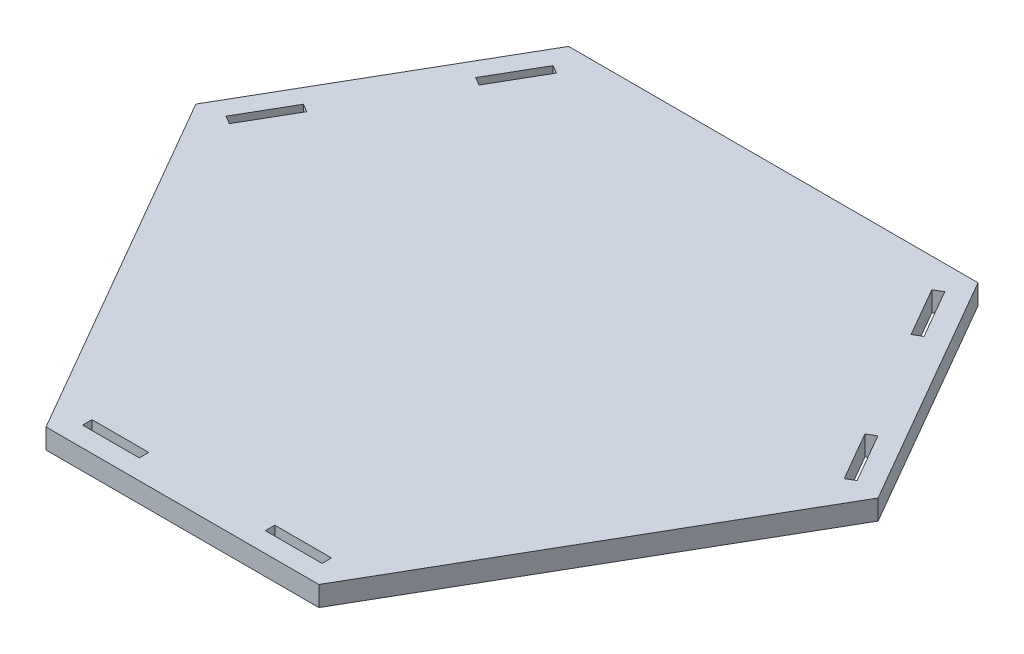
ISO-10303-21;
HEADER;
FILE_DESCRIPTION(('STEP AP214'),'2;1');
FILE_NAME('part.step','',(''),(''),'','','');
FILE_SCHEMA(('AUTOMOTIVE_DESIGN { 1 0 10303 214 1 1 1 1 }'));
ENDSEC;
DATA;
#1=APPLICATION_CONTEXT('core data for automotive mechanical design processes');
#2=APPLICATION_PROTOCOL_DEFINITION('international standard','automotive_design',2000,#1);
#3=PRODUCT_CONTEXT('',#1,'mechanical');
#4=PRODUCT('Part','Part','',(#3));
#5=PRODUCT_RELATED_PRODUCT_CATEGORY('part','',(#4));
#6=PRODUCT_DEFINITION_FORMATION('','',#4);
#7=PRODUCT_DEFINITION_CONTEXT('part definition',#1,'design');
#8=PRODUCT_DEFINITION('design','',#6,#7);
#9=PRODUCT_DEFINITION_SHAPE('','',#8);
#10=(LENGTH_UNIT() NAMED_UNIT(*) SI_UNIT(.MILLI.,.METRE.));
#11=(NAMED_UNIT(*) PLANE_ANGLE_UNIT() SI_UNIT($,.RADIAN.));
#12=(NAMED_UNIT(*) SI_UNIT($,.STERADIAN.) SOLID_ANGLE_UNIT());
#13=UNCERTAINTY_MEASURE_WITH_UNIT(LENGTH_MEASURE(1.E-05),#10,'distance_accuracy_value','');
#14=(GEOMETRIC_REPRESENTATION_CONTEXT(3) GLOBAL_UNCERTAINTY_ASSIGNED_CONTEXT((#13)) GLOBAL_UNIT_ASSIGNED_CONTEXT((#10,
#11,#12)) REPRESENTATION_CONTEXT('',''));
#15=CARTESIAN_POINT('',(0.,0.,0.));
#16=DIRECTION('',(0.,0.,1.));
#17=DIRECTION('',(1.,0.,0.));
#18=AXIS2_PLACEMENT_3D('',#15,#16,#17);
#19=CARTESIAN_POINT('',(-86.6025403784439,6.35,-50.));
#20=DIRECTION('',(0.866025403784439,0.,0.5));
#21=DIRECTION('',(0.5,0.,-0.866025403784439));
#22=AXIS2_PLACEMENT_3D('',#19,#20,#21);
#23=PLANE('',#22);
#24=DIRECTION('',(-0.5,0.,0.866025403784439));
#25=VECTOR('',#24,1.);
#26=CARTESIAN_POINT('',(-86.6025403784439,0.,-50.));
#27=LINE('',#26,#25);
#28=CARTESIAN_POINT('',(-64.9519052838329,0.,-87.5));
#29=VERTEX_POINT('',#28);
#30=CARTESIAN_POINT('',(-108.253175473055,0.,-12.5));
#31=VERTEX_POINT('',#30);
#32=EDGE_CURVE('E428',#29,#31,#27,.T.);
#33=ORIENTED_EDGE('',*,*,#32,.T.);
#34=DIRECTION('',(0.,-1.,0.));
#35=VECTOR('',#34,1.);
#36=CARTESIAN_POINT('',(-108.253175473055,6.35,-12.5));
#37=LINE('',#36,#35);
#38=CARTESIAN_POINT('',(-108.253175473055,6.35,-12.5));
#39=VERTEX_POINT('',#38);
#40=EDGE_CURVE('E11',#39,#31,#37,.T.);
#41=ORIENTED_EDGE('',*,*,#40,.F.);
#42=DIRECTION('',(-0.5,0.,0.866025403784439));
#43=VECTOR('',#42,1.);
#44=CARTESIAN_POINT('',(-86.6025403784439,6.35,-50.));
#45=LINE('',#44,#43);
#46=CARTESIAN_POINT('',(-64.9519052838329,6.35,-87.5));
#47=VERTEX_POINT('',#46);
#48=EDGE_CURVE('E435',#47,#39,#45,.T.);
#49=ORIENTED_EDGE('',*,*,#48,.F.);
#50=DIRECTION('',(0.,-1.,0.));
#51=VECTOR('',#50,1.);
#52=CARTESIAN_POINT('',(-64.9519052838329,6.35,-87.5));
#53=LINE('',#52,#51);
#54=EDGE_CURVE('E449',#47,#29,#53,.T.);
#55=ORIENTED_EDGE('',*,*,#54,.T.);
#56=EDGE_LOOP('',(#33,#41,#49,#55));
#57=FACE_BOUND('',#56,.T.);
#58=ADVANCED_FACE('F39',(#57),#23,.F.);
#59=CARTESIAN_POINT('',(-75.7772228311384,6.35,43.75));
#60=DIRECTION('',(0.866025403784439,0.,-0.5));
#61=DIRECTION('',(-0.5,0.,-0.866025403784439));
#62=AXIS2_PLACEMENT_3D('',#59,#60,#61);
#63=PLANE('',#62);
#64=DIRECTION('',(0.5,0.,0.866025403784439));
#65=VECTOR('',#64,1.);
#66=CARTESIAN_POINT('',(-75.7772228311384,0.,43.75));
#67=LINE('',#66,#65);
#68=CARTESIAN_POINT('',(-43.3012701892219,0.,100.));
#69=VERTEX_POINT('',#68);
#70=EDGE_CURVE('E452',#31,#69,#67,.T.);
#71=ORIENTED_EDGE('',*,*,#70,.T.);
#72=DIRECTION('',(0.,-1.,0.));
#73=VECTOR('',#72,1.);
#74=CARTESIAN_POINT('',(-43.3012701892219,6.35,100.));
#75=LINE('',#74,#73);
#76=CARTESIAN_POINT('',(-43.3012701892219,6.35,100.));
#77=VERTEX_POINT('',#76);
#78=EDGE_CURVE('E46',#77,#69,#75,.T.);
#79=ORIENTED_EDGE('',*,*,#78,.F.);
#80=DIRECTION('',(0.5,0.,0.866025403784439));
#81=VECTOR('',#80,1.);
#82=CARTESIAN_POINT('',(-75.7772228311384,6.35,43.75));
#83=LINE('',#82,#81);
#84=EDGE_CURVE('E438',#39,#77,#83,.T.);
#85=ORIENTED_EDGE('',*,*,#84,.F.);
#86=ORIENTED_EDGE('',*,*,#40,.T.);
#87=EDGE_LOOP('',(#71,#79,#85,#86));
#88=FACE_BOUND('',#87,.T.);
#89=ADVANCED_FACE('F498',(#88),#63,.F.);
#90=CARTESIAN_POINT('',(0.,6.35,100.));
#91=DIRECTION('',(0.,0.,-1.));
#92=DIRECTION('',(-1.,0.,0.));
#93=AXIS2_PLACEMENT_3D('',#90,#91,#92);
#94=PLANE('',#93);
#95=DIRECTION('',(1.,0.,0.));
#96=VECTOR('',#95,1.);
#97=CARTESIAN_POINT('',(0.,0.,100.));
#98=LINE('',#97,#96);
#99=CARTESIAN_POINT('',(43.3012701892219,0.,100.));
#100=VERTEX_POINT('',#99);
#101=EDGE_CURVE('E454',#69,#100,#98,.T.);
#102=ORIENTED_EDGE('',*,*,#101,.T.);
#103=DIRECTION('',(0.,-1.,0.));
#104=VECTOR('',#103,1.);
#105=CARTESIAN_POINT('',(43.3012701892219,6.35,100.));
#106=LINE('',#105,#104);
#107=CARTESIAN_POINT('',(43.3012701892219,6.35,100.));
#108=VERTEX_POINT('',#107);
#109=EDGE_CURVE('E469',#108,#100,#106,.T.);
#110=ORIENTED_EDGE('',*,*,#109,.F.);
#111=DIRECTION('',(1.,0.,0.));
#112=VECTOR('',#111,1.);
#113=CARTESIAN_POINT('',(0.,6.35,100.));
#114=LINE('',#113,#112);
#115=EDGE_CURVE('E441',#77,#108,#114,.T.);
#116=ORIENTED_EDGE('',*,*,#115,.F.);
#117=ORIENTED_EDGE('',*,*,#78,.T.);
#118=EDGE_LOOP('',(#102,#110,#116,#117));
#119=FACE_BOUND('',#118,.T.);
#120=ADVANCED_FACE('F476',(#119),#94,.F.);
#121=CARTESIAN_POINT('',(75.7772228311384,6.35,43.75));
#122=DIRECTION('',(-0.866025403784439,0.,-0.5));
#123=DIRECTION('',(-0.5,0.,0.866025403784439));
#124=AXIS2_PLACEMENT_3D('',#121,#122,#123);
#125=PLANE('',#124);
#126=DIRECTION('',(0.5,0.,-0.866025403784439));
#127=VECTOR('',#126,1.);
#128=CARTESIAN_POINT('',(75.7772228311384,0.,43.75));
#129=LINE('',#128,#127);
#130=CARTESIAN_POINT('',(108.253175473055,0.,-12.5));
#131=VERTEX_POINT('',#130);
#132=EDGE_CURVE('E456',#100,#131,#129,.T.);
#133=ORIENTED_EDGE('',*,*,#132,.T.);
#134=DIRECTION('',(0.,-1.,0.));
#135=VECTOR('',#134,1.);
#136=CARTESIAN_POINT('',(108.253175473055,6.35,-12.5));
#137=LINE('',#136,#135);
#138=CARTESIAN_POINT('',(108.253175473055,6.35,-12.5));
#139=VERTEX_POINT('',#138);
#140=EDGE_CURVE('E466',#139,#131,#137,.T.);
#141=ORIENTED_EDGE('',*,*,#140,.F.);
#142=DIRECTION('',(0.5,0.,-0.866025403784439));
#143=VECTOR('',#142,1.);
#144=CARTESIAN_POINT('',(75.7772228311384,6.35,43.75));
#145=LINE('',#144,#143);
#146=EDGE_CURVE('E443',#108,#139,#145,.T.);
#147=ORIENTED_EDGE('',*,*,#146,.F.);
#148=ORIENTED_EDGE('',*,*,#109,.T.);
#149=EDGE_LOOP('',(#133,#141,#147,#148));
#150=FACE_BOUND('',#149,.T.);
#151=ADVANCED_FACE('F486',(#150),#125,.F.);
#152=CARTESIAN_POINT('',(86.6025403784439,6.35,-50.));
#153=DIRECTION('',(-0.866025403784439,0.,0.5));
#154=DIRECTION('',(0.5,0.,0.866025403784439));
#155=AXIS2_PLACEMENT_3D('',#152,#153,#154);
#156=PLANE('',#155);
#157=DIRECTION('',(-0.5,0.,-0.866025403784439));
#158=VECTOR('',#157,1.);
#159=CARTESIAN_POINT('',(86.6025403784439,0.,-50.));
#160=LINE('',#159,#158);
#161=CARTESIAN_POINT('',(64.9519052838329,0.,-87.5));
#162=VERTEX_POINT('',#161);
#163=EDGE_CURVE('E458',#131,#162,#160,.T.);
#164=ORIENTED_EDGE('',*,*,#163,.T.);
#165=DIRECTION('',(0.,-1.,0.));
#166=VECTOR('',#165,1.);
#167=CARTESIAN_POINT('',(64.9519052838329,6.35,-87.5));
#168=LINE('',#167,#166);
#169=CARTESIAN_POINT('',(64.9519052838329,6.35,-87.5));
#170=VERTEX_POINT('',#169);
#171=EDGE_CURVE('E463',#170,#162,#168,.T.);
#172=ORIENTED_EDGE('',*,*,#171,.F.);
#173=DIRECTION('',(-0.5,0.,-0.866025403784439));
#174=VECTOR('',#173,1.);
#175=CARTESIAN_POINT('',(86.6025403784439,6.35,-50.));
#176=LINE('',#175,#174);
#177=EDGE_CURVE('E445',#139,#170,#176,.T.);
#178=ORIENTED_EDGE('',*,*,#177,.F.);
#179=ORIENTED_EDGE('',*,*,#140,.T.);
#180=EDGE_LOOP('',(#164,#172,#178,#179));
#181=FACE_BOUND('',#180,.T.);
#182=ADVANCED_FACE('F490',(#181),#156,.F.);
#183=CARTESIAN_POINT('',(0.,6.35,-87.5));
#184=DIRECTION('',(0.,0.,1.));
#185=DIRECTION('',(1.,0.,0.));
#186=AXIS2_PLACEMENT_3D('',#183,#184,#185);
#187=PLANE('',#186);
#188=DIRECTION('',(-1.,0.,0.));
#189=VECTOR('',#188,1.);
#190=CARTESIAN_POINT('',(0.,0.,-87.5));
#191=LINE('',#190,#189);
#192=EDGE_CURVE('E439',#162,#29,#191,.T.);
#193=ORIENTED_EDGE('',*,*,#192,.T.);
#194=ORIENTED_EDGE('',*,*,#54,.F.);
#195=DIRECTION('',(-1.,0.,0.));
#196=VECTOR('',#195,1.);
#197=CARTESIAN_POINT('',(0.,6.35,-87.5));
#198=LINE('',#197,#196);
#199=EDGE_CURVE('E447',#170,#47,#198,.T.);
#200=ORIENTED_EDGE('',*,*,#199,.F.);
#201=ORIENTED_EDGE('',*,*,#171,.T.);
#202=EDGE_LOOP('',(#193,#194,#200,#201));
#203=FACE_BOUND('',#202,.T.);
#204=ADVANCED_FACE('F501',(#203),#187,.F.);
#205=CARTESIAN_POINT('',(0.,6.35,0.));
#206=DIRECTION('',(0.,1.,0.));
#207=DIRECTION('',(0.,0.,1.));
#208=AXIS2_PLACEMENT_3D('',#205,#206,#207);
#209=PLANE('',#208);
#210=DIRECTION('',(0.866025403784439,0.,-0.499999999999998));
#211=VECTOR('',#210,1.);
#212=CARTESIAN_POINT('',(97.5485041232486,6.35,-12.4410346561914));
#213=LINE('',#212,#211);
#214=CARTESIAN_POINT('',(97.5485041232486,6.35,-12.4410346561914));
#215=VERTEX_POINT('',#214);
#216=CARTESIAN_POINT('',(100.146580334602,6.35,-13.9410346561914));
#217=VERTEX_POINT('',#216);
#218=EDGE_CURVE('E53',#215,#217,#213,.T.);
#219=ORIENTED_EDGE('',*,*,#218,.F.);
#220=DIRECTION('',(0.5,0.,0.866025403784439));
#221=VECTOR('',#220,1.);
#222=CARTESIAN_POINT('',(97.5485041232486,6.35,-12.4410346561914));
#223=LINE('',#222,#221);
#224=CARTESIAN_POINT('',(88.5485041232486,6.35,-28.0294919243113));
#225=VERTEX_POINT('',#224);
#226=EDGE_CURVE('E378',#225,#215,#223,.T.);
#227=ORIENTED_EDGE('',*,*,#226,.F.);
#228=DIRECTION('',(-0.866025403784436,0.,0.500000000000004));
#229=VECTOR('',#228,1.);
#230=CARTESIAN_POINT('',(88.5485041232486,6.35,-28.0294919243113));
#231=LINE('',#230,#229);
#232=CARTESIAN_POINT('',(91.1465803346019,6.35,-29.5294919243113));
#233=VERTEX_POINT('',#232);
#234=EDGE_CURVE('E392',#233,#225,#231,.T.);
#235=ORIENTED_EDGE('',*,*,#234,.F.);
#236=DIRECTION('',(-0.5,0.,-0.866025403784439));
#237=VECTOR('',#236,1.);
#238=CARTESIAN_POINT('',(100.146580334602,6.35,-13.9410346561914));
#239=LINE('',#238,#237);
#240=EDGE_CURVE('E389',#217,#233,#239,.T.);
#241=ORIENTED_EDGE('',*,*,#240,.F.);
#242=EDGE_LOOP('',(#219,#227,#235,#241));
#243=FACE_BOUND('',#242,.T.);
#244=DIRECTION('',(-1.,0.,0.));
#245=VECTOR('',#244,1.);
#246=CARTESIAN_POINT('',(38.,6.35,90.7));
#247=LINE('',#246,#245);
#248=CARTESIAN_POINT('',(38.,6.35,90.7));
#249=VERTEX_POINT('',#248);
#250=CARTESIAN_POINT('',(20.,6.35,90.7));
#251=VERTEX_POINT('',#250);
#252=EDGE_CURVE('E61',#249,#251,#247,.T.);
#253=ORIENTED_EDGE('',*,*,#252,.F.);
#254=DIRECTION('',(0.,0.,-1.));
#255=VECTOR('',#254,1.);
#256=CARTESIAN_POINT('',(38.,6.35,90.7));
#257=LINE('',#256,#255);
#258=CARTESIAN_POINT('',(38.,6.35,93.7));
#259=VERTEX_POINT('',#258);
#260=EDGE_CURVE('E316',#259,#249,#257,.T.);
#261=ORIENTED_EDGE('',*,*,#260,.F.);
#262=DIRECTION('',(1.,0.,0.));
#263=VECTOR('',#262,1.);
#264=CARTESIAN_POINT('',(38.,6.35,93.7));
#265=LINE('',#264,#263);
#266=CARTESIAN_POINT('',(20.,6.35,93.7));
#267=VERTEX_POINT('',#266);
#268=EDGE_CURVE('E331',#267,#259,#265,.T.);
#269=ORIENTED_EDGE('',*,*,#268,.F.);
#270=DIRECTION('',(0.,0.,1.));
#271=VECTOR('',#270,1.);
#272=CARTESIAN_POINT('',(20.,6.35,90.7));
#273=LINE('',#272,#271);
#274=EDGE_CURVE('E327',#251,#267,#273,.T.);
#275=ORIENTED_EDGE('',*,*,#274,.F.);
#276=EDGE_LOOP('',(#253,#261,#269,#275));
#277=FACE_BOUND('',#276,.T.);
#278=DIRECTION('',(-0.5,0.,0.866025403784439));
#279=VECTOR('',#278,1.);
#280=CARTESIAN_POINT('',(-62.1465803346016,6.35,-79.7589653438085));
#281=LINE('',#280,#279);
#282=CARTESIAN_POINT('',(-62.1465803346016,6.35,-79.7589653438085));
#283=VERTEX_POINT('',#282);
#284=CARTESIAN_POINT('',(-71.1465803346016,6.35,-64.1705080756886));
#285=VERTEX_POINT('',#284);
#286=EDGE_CURVE('E276',#283,#285,#281,.T.);
#287=ORIENTED_EDGE('',*,*,#286,.F.);
#288=DIRECTION('',(-0.866025403784441,0.,-0.499999999999996));
#289=VECTOR('',#288,1.);
#290=CARTESIAN_POINT('',(-62.1465803346016,6.35,-79.7589653438085));
#291=LINE('',#290,#289);
#292=CARTESIAN_POINT('',(-59.5485041232483,6.35,-78.2589653438085));
#293=VERTEX_POINT('',#292);
#294=EDGE_CURVE('E348',#293,#283,#291,.T.);
#295=ORIENTED_EDGE('',*,*,#294,.F.);
#296=DIRECTION('',(0.499999999999999,0.,-0.866025403784439));
#297=VECTOR('',#296,1.);
#298=CARTESIAN_POINT('',(-59.5485041232483,6.35,-78.2589653438085));
#299=LINE('',#298,#297);
#300=CARTESIAN_POINT('',(-68.5485041232483,6.35,-62.6705080756886));
#301=VERTEX_POINT('',#300);
#302=EDGE_CURVE('E362',#301,#293,#299,.T.);
#303=ORIENTED_EDGE('',*,*,#302,.F.);
#304=DIRECTION('',(0.866025403784441,0.,0.499999999999997));
#305=VECTOR('',#304,1.);
#306=CARTESIAN_POINT('',(-71.1465803346016,6.35,-64.1705080756886));
#307=LINE('',#306,#305);
#308=EDGE_CURVE('E359',#285,#301,#307,.T.);
#309=ORIENTED_EDGE('',*,*,#308,.F.);
#310=EDGE_LOOP('',(#287,#295,#303,#309));
#311=FACE_BOUND('',#310,.T.);
#312=DIRECTION('',(0.866025403784435,0.,0.500000000000006));
#313=VECTOR('',#312,1.);
#314=CARTESIAN_POINT('',(-100.146580334602,6.35,-13.9410346561911));
#315=LINE('',#314,#313);
#316=CARTESIAN_POINT('',(-100.146580334602,6.35,-13.9410346561911));
#317=VERTEX_POINT('',#316);
#318=CARTESIAN_POINT('',(-97.5485041232483,6.35,-12.4410346561911));
#319=VERTEX_POINT('',#318);
#320=EDGE_CURVE('E242',#317,#319,#315,.T.);
#321=ORIENTED_EDGE('',*,*,#320,.F.);
#322=DIRECTION('',(-0.5,0.,0.866025403784439));
#323=VECTOR('',#322,1.);
#324=CARTESIAN_POINT('',(-100.146580334602,6.35,-13.9410346561911));
#325=LINE('',#324,#323);
#326=CARTESIAN_POINT('',(-91.1465803346016,6.35,-29.529491924311));
#327=VERTEX_POINT('',#326);
#328=EDGE_CURVE('E260',#327,#317,#325,.T.);
#329=ORIENTED_EDGE('',*,*,#328,.F.);
#330=DIRECTION('',(-0.866025403784438,0.,-0.500000000000002));
#331=VECTOR('',#330,1.);
#332=CARTESIAN_POINT('',(-91.1465803346016,6.35,-29.529491924311));
#333=LINE('',#332,#331);
#334=CARTESIAN_POINT('',(-88.5485041232483,6.35,-28.029491924311));
#335=VERTEX_POINT('',#334);
#336=EDGE_CURVE('E263',#335,#327,#333,.T.);
#337=ORIENTED_EDGE('',*,*,#336,.F.);
#338=DIRECTION('',(0.500000000000001,0.,-0.866025403784438));
#339=VECTOR('',#338,1.);
#340=CARTESIAN_POINT('',(-97.5485041232483,6.35,-12.4410346561911));
#341=LINE('',#340,#339);
#342=EDGE_CURVE('E269',#319,#335,#341,.T.);
#343=ORIENTED_EDGE('',*,*,#342,.F.);
#344=EDGE_LOOP('',(#321,#329,#337,#343));
#345=FACE_BOUND('',#344,.T.);
#346=DIRECTION('',(0.5,0.,0.866025403784439));
#347=VECTOR('',#346,1.);
#348=CARTESIAN_POINT('',(59.5485041232486,6.35,-78.2589653438087));
#349=LINE('',#348,#347);
#350=CARTESIAN_POINT('',(59.5485041232486,6.35,-78.2589653438087));
#351=VERTEX_POINT('',#350);
#352=CARTESIAN_POINT('',(68.5485041232486,6.35,-62.6705080756888));
#353=VERTEX_POINT('',#352);
#354=EDGE_CURVE('E294',#351,#353,#349,.T.);
#355=ORIENTED_EDGE('',*,*,#354,.F.);
#356=DIRECTION('',(-0.866025403784438,0.,0.500000000000001));
#357=VECTOR('',#356,1.);
#358=CARTESIAN_POINT('',(59.5485041232486,6.35,-78.2589653438087));
#359=LINE('',#358,#357);
#360=CARTESIAN_POINT('',(62.1465803346019,6.35,-79.7589653438087));
#361=VERTEX_POINT('',#360);
#362=EDGE_CURVE('E284',#361,#351,#359,.T.);
#363=ORIENTED_EDGE('',*,*,#362,.F.);
#364=DIRECTION('',(-0.5,0.,-0.866025403784439));
#365=VECTOR('',#364,1.);
#366=CARTESIAN_POINT('',(62.1465803346019,6.35,-79.7589653438087));
#367=LINE('',#366,#365);
#368=CARTESIAN_POINT('',(71.1465803346019,6.35,-64.1705080756888));
#369=VERTEX_POINT('',#368);
#370=EDGE_CURVE('E300',#369,#361,#367,.T.);
#371=ORIENTED_EDGE('',*,*,#370,.F.);
#372=DIRECTION('',(0.866025403784442,0.,-0.499999999999995));
#373=VECTOR('',#372,1.);
#374=CARTESIAN_POINT('',(68.5485041232486,6.35,-62.6705080756888));
#375=LINE('',#374,#373);
#376=EDGE_CURVE('E296',#353,#369,#375,.T.);
#377=ORIENTED_EDGE('',*,*,#376,.F.);
#378=EDGE_LOOP('',(#355,#363,#371,#377));
#379=FACE_BOUND('',#378,.T.);
#380=DIRECTION('',(0.,0.,1.));
#381=VECTOR('',#380,1.);
#382=CARTESIAN_POINT('',(-38.,6.35,90.7));
#383=LINE('',#382,#381);
#384=CARTESIAN_POINT('',(-38.,6.35,90.7));
#385=VERTEX_POINT('',#384);
#386=CARTESIAN_POINT('',(-38.,6.35,93.7));
#387=VERTEX_POINT('',#386);
#388=EDGE_CURVE('E338',#385,#387,#383,.T.);
#389=ORIENTED_EDGE('',*,*,#388,.F.);
#390=DIRECTION('',(-1.,0.,0.));
#391=VECTOR('',#390,1.);
#392=CARTESIAN_POINT('',(-38.,6.35,90.7));
#393=LINE('',#392,#391);
#394=CARTESIAN_POINT('',(-20.,6.35,90.7));
#395=VERTEX_POINT('',#394);
#396=EDGE_CURVE('E407',#395,#385,#393,.T.);
#397=ORIENTED_EDGE('',*,*,#396,.F.);
#398=DIRECTION('',(0.,0.,-1.));
#399=VECTOR('',#398,1.);
#400=CARTESIAN_POINT('',(-20.,6.35,90.7));
#401=LINE('',#400,#399);
#402=CARTESIAN_POINT('',(-20.,6.35,93.7));
#403=VERTEX_POINT('',#402);
#404=EDGE_CURVE('E421',#403,#395,#401,.T.);
#405=ORIENTED_EDGE('',*,*,#404,.F.);
#406=DIRECTION('',(1.,0.,0.));
#407=VECTOR('',#406,1.);
#408=CARTESIAN_POINT('',(-38.,6.35,93.7));
#409=LINE('',#408,#407);
#410=EDGE_CURVE('E418',#387,#403,#409,.T.);
#411=ORIENTED_EDGE('',*,*,#410,.F.);
#412=EDGE_LOOP('',(#389,#397,#405,#411));
#413=FACE_BOUND('',#412,.T.);
#414=ORIENTED_EDGE('',*,*,#48,.T.);
#415=ORIENTED_EDGE('',*,*,#84,.T.);
#416=ORIENTED_EDGE('',*,*,#115,.T.);
#417=ORIENTED_EDGE('',*,*,#146,.T.);
#418=ORIENTED_EDGE('',*,*,#177,.T.);
#419=ORIENTED_EDGE('',*,*,#199,.T.);
#420=EDGE_LOOP('',(#414,#415,#416,#417,#418,#419));
#421=FACE_BOUND('',#420,.T.);
#422=ADVANCED_FACE('F494',(#243,#277,#311,#345,#379,#413,#421),#209,.T.);
#423=CARTESIAN_POINT('',(0.,0.,0.));
#424=DIRECTION('',(0.,1.,0.));
#425=DIRECTION('',(0.,0.,1.));
#426=AXIS2_PLACEMENT_3D('',#423,#424,#425);
#427=PLANE('',#426);
#428=DIRECTION('',(0.5,0.,0.866025403784439));
#429=VECTOR('',#428,1.);
#430=CARTESIAN_POINT('',(97.5485041232486,0.,-12.4410346561914));
#431=LINE('',#430,#429);
#432=CARTESIAN_POINT('',(88.5485041232486,0.,-28.0294919243113));
#433=VERTEX_POINT('',#432);
#434=CARTESIAN_POINT('',(97.5485041232486,0.,-12.4410346561914));
#435=VERTEX_POINT('',#434);
#436=EDGE_CURVE('E384',#433,#435,#431,.T.);
#437=ORIENTED_EDGE('',*,*,#436,.T.);
#438=DIRECTION('',(0.866025403784439,0.,-0.499999999999998));
#439=VECTOR('',#438,1.);
#440=CARTESIAN_POINT('',(97.5485041232486,0.,-12.4410346561914));
#441=LINE('',#440,#439);
#442=CARTESIAN_POINT('',(100.146580334602,0.,-13.9410346561914));
#443=VERTEX_POINT('',#442);
#444=EDGE_CURVE('E374',#435,#443,#441,.T.);
#445=ORIENTED_EDGE('',*,*,#444,.T.);
#446=DIRECTION('',(-0.5,0.,-0.866025403784439));
#447=VECTOR('',#446,1.);
#448=CARTESIAN_POINT('',(100.146580334602,0.,-13.9410346561914));
#449=LINE('',#448,#447);
#450=CARTESIAN_POINT('',(91.1465803346019,0.,-29.5294919243113));
#451=VERTEX_POINT('',#450);
#452=EDGE_CURVE('E377',#443,#451,#449,.T.);
#453=ORIENTED_EDGE('',*,*,#452,.T.);
#454=DIRECTION('',(-0.866025403784436,0.,0.500000000000004));
#455=VECTOR('',#454,1.);
#456=CARTESIAN_POINT('',(88.5485041232486,0.,-28.0294919243113));
#457=LINE('',#456,#455);
#458=EDGE_CURVE('E381',#451,#433,#457,.T.);
#459=ORIENTED_EDGE('',*,*,#458,.T.);
#460=EDGE_LOOP('',(#437,#445,#453,#459));
#461=FACE_BOUND('',#460,.T.);
#462=DIRECTION('',(0.,0.,-1.));
#463=VECTOR('',#462,1.);
#464=CARTESIAN_POINT('',(38.,0.,90.7));
#465=LINE('',#464,#463);
#466=CARTESIAN_POINT('',(38.,0.,93.7));
#467=VERTEX_POINT('',#466);
#468=CARTESIAN_POINT('',(38.,0.,90.7));
#469=VERTEX_POINT('',#468);
#470=EDGE_CURVE('E322',#467,#469,#465,.T.);
#471=ORIENTED_EDGE('',*,*,#470,.T.);
#472=DIRECTION('',(-1.,0.,0.));
#473=VECTOR('',#472,1.);
#474=CARTESIAN_POINT('',(38.,0.,90.7));
#475=LINE('',#474,#473);
#476=CARTESIAN_POINT('',(20.,0.,90.7));
#477=VERTEX_POINT('',#476);
#478=EDGE_CURVE('E312',#469,#477,#475,.T.);
#479=ORIENTED_EDGE('',*,*,#478,.T.);
#480=DIRECTION('',(0.,0.,1.));
#481=VECTOR('',#480,1.);
#482=CARTESIAN_POINT('',(20.,0.,90.7));
#483=LINE('',#482,#481);
#484=CARTESIAN_POINT('',(20.,0.,93.7));
#485=VERTEX_POINT('',#484);
#486=EDGE_CURVE('E315',#477,#485,#483,.T.);
#487=ORIENTED_EDGE('',*,*,#486,.T.);
#488=DIRECTION('',(1.,0.,0.));
#489=VECTOR('',#488,1.);
#490=CARTESIAN_POINT('',(38.,0.,93.7));
#491=LINE('',#490,#489);
#492=EDGE_CURVE('E319',#485,#467,#491,.T.);
#493=ORIENTED_EDGE('',*,*,#492,.T.);
#494=EDGE_LOOP('',(#471,#479,#487,#493));
#495=FACE_BOUND('',#494,.T.);
#496=DIRECTION('',(-0.866025403784441,0.,-0.499999999999996));
#497=VECTOR('',#496,1.);
#498=CARTESIAN_POINT('',(-62.1465803346016,0.,-79.7589653438085));
#499=LINE('',#498,#497);
#500=CARTESIAN_POINT('',(-59.5485041232483,0.,-78.2589653438085));
#501=VERTEX_POINT('',#500);
#502=CARTESIAN_POINT('',(-62.1465803346016,0.,-79.7589653438085));
#503=VERTEX_POINT('',#502);
#504=EDGE_CURVE('E354',#501,#503,#499,.T.);
#505=ORIENTED_EDGE('',*,*,#504,.T.);
#506=DIRECTION('',(-0.5,0.,0.866025403784439));
#507=VECTOR('',#506,1.);
#508=CARTESIAN_POINT('',(-62.1465803346016,0.,-79.7589653438085));
#509=LINE('',#508,#507);
#510=CARTESIAN_POINT('',(-71.1465803346016,0.,-64.1705080756886));
#511=VERTEX_POINT('',#510);
#512=EDGE_CURVE('E344',#503,#511,#509,.T.);
#513=ORIENTED_EDGE('',*,*,#512,.T.);
#514=DIRECTION('',(0.866025403784441,0.,0.499999999999997));
#515=VECTOR('',#514,1.);
#516=CARTESIAN_POINT('',(-71.1465803346016,0.,-64.1705080756886));
#517=LINE('',#516,#515);
#518=CARTESIAN_POINT('',(-68.5485041232483,0.,-62.6705080756886));
#519=VERTEX_POINT('',#518);
#520=EDGE_CURVE('E347',#511,#519,#517,.T.);
#521=ORIENTED_EDGE('',*,*,#520,.T.);
#522=DIRECTION('',(0.499999999999999,0.,-0.866025403784439));
#523=VECTOR('',#522,1.);
#524=CARTESIAN_POINT('',(-59.5485041232483,0.,-78.2589653438085));
#525=LINE('',#524,#523);
#526=EDGE_CURVE('E351',#519,#501,#525,.T.);
#527=ORIENTED_EDGE('',*,*,#526,.T.);
#528=EDGE_LOOP('',(#505,#513,#521,#527));
#529=FACE_BOUND('',#528,.T.);
#530=DIRECTION('',(-0.5,0.,0.866025403784439));
#531=VECTOR('',#530,1.);
#532=CARTESIAN_POINT('',(-100.146580334602,0.,-13.9410346561911));
#533=LINE('',#532,#531);
#534=CARTESIAN_POINT('',(-91.1465803346016,0.,-29.529491924311));
#535=VERTEX_POINT('',#534);
#536=CARTESIAN_POINT('',(-100.146580334602,0.,-13.9410346561911));
#537=VERTEX_POINT('',#536);
#538=EDGE_CURVE('E247',#535,#537,#533,.T.);
#539=ORIENTED_EDGE('',*,*,#538,.T.);
#540=DIRECTION('',(0.866025403784435,0.,0.500000000000006));
#541=VECTOR('',#540,1.);
#542=CARTESIAN_POINT('',(-100.146580334602,0.,-13.9410346561911));
#543=LINE('',#542,#541);
#544=CARTESIAN_POINT('',(-97.5485041232483,0.,-12.4410346561911));
#545=VERTEX_POINT('',#544);
#546=EDGE_CURVE('E239',#537,#545,#543,.T.);
#547=ORIENTED_EDGE('',*,*,#546,.T.);
#548=DIRECTION('',(0.500000000000001,0.,-0.866025403784438));
#549=VECTOR('',#548,1.);
#550=CARTESIAN_POINT('',(-97.5485041232483,0.,-12.4410346561911));
#551=LINE('',#550,#549);
#552=CARTESIAN_POINT('',(-88.5485041232483,0.,-28.029491924311));
#553=VERTEX_POINT('',#552);
#554=EDGE_CURVE('E251',#545,#553,#551,.T.);
#555=ORIENTED_EDGE('',*,*,#554,.T.);
#556=DIRECTION('',(-0.866025403784438,0.,-0.500000000000002));
#557=VECTOR('',#556,1.);
#558=CARTESIAN_POINT('',(-91.1465803346016,0.,-29.529491924311));
#559=LINE('',#558,#557);
#560=EDGE_CURVE('E255',#553,#535,#559,.T.);
#561=ORIENTED_EDGE('',*,*,#560,.T.);
#562=EDGE_LOOP('',(#539,#547,#555,#561));
#563=FACE_BOUND('',#562,.T.);
#564=DIRECTION('',(-0.866025403784438,0.,0.500000000000001));
#565=VECTOR('',#564,1.);
#566=CARTESIAN_POINT('',(59.5485041232486,0.,-78.2589653438087));
#567=LINE('',#566,#565);
#568=CARTESIAN_POINT('',(62.1465803346019,0.,-79.7589653438087));
#569=VERTEX_POINT('',#568);
#570=CARTESIAN_POINT('',(59.5485041232486,0.,-78.2589653438087));
#571=VERTEX_POINT('',#570);
#572=EDGE_CURVE('E290',#569,#571,#567,.T.);
#573=ORIENTED_EDGE('',*,*,#572,.T.);
#574=DIRECTION('',(0.5,0.,0.866025403784439));
#575=VECTOR('',#574,1.);
#576=CARTESIAN_POINT('',(59.5485041232486,0.,-78.2589653438087));
#577=LINE('',#576,#575);
#578=CARTESIAN_POINT('',(68.5485041232486,0.,-62.6705080756888));
#579=VERTEX_POINT('',#578);
#580=EDGE_CURVE('E280',#571,#579,#577,.T.);
#581=ORIENTED_EDGE('',*,*,#580,.T.);
#582=DIRECTION('',(0.866025403784442,0.,-0.499999999999995));
#583=VECTOR('',#582,1.);
#584=CARTESIAN_POINT('',(68.5485041232486,0.,-62.6705080756888));
#585=LINE('',#584,#583);
#586=CARTESIAN_POINT('',(71.1465803346019,0.,-64.1705080756888));
#587=VERTEX_POINT('',#586);
#588=EDGE_CURVE('E283',#579,#587,#585,.T.);
#589=ORIENTED_EDGE('',*,*,#588,.T.);
#590=DIRECTION('',(-0.5,0.,-0.866025403784439));
#591=VECTOR('',#590,1.);
#592=CARTESIAN_POINT('',(62.1465803346019,0.,-79.7589653438087));
#593=LINE('',#592,#591);
#594=EDGE_CURVE('E287',#587,#569,#593,.T.);
#595=ORIENTED_EDGE('',*,*,#594,.T.);
#596=EDGE_LOOP('',(#573,#581,#589,#595));
#597=FACE_BOUND('',#596,.T.);
#598=DIRECTION('',(-1.,0.,0.));
#599=VECTOR('',#598,1.);
#600=CARTESIAN_POINT('',(-38.,0.,90.7));
#601=LINE('',#600,#599);
#602=CARTESIAN_POINT('',(-20.,0.,90.7));
#603=VERTEX_POINT('',#602);
#604=CARTESIAN_POINT('',(-38.,0.,90.7));
#605=VERTEX_POINT('',#604);
#606=EDGE_CURVE('E413',#603,#605,#601,.T.);
#607=ORIENTED_EDGE('',*,*,#606,.T.);
#608=DIRECTION('',(0.,0.,1.));
#609=VECTOR('',#608,1.);
#610=CARTESIAN_POINT('',(-38.,0.,90.7));
#611=LINE('',#610,#609);
#612=CARTESIAN_POINT('',(-38.,0.,93.7));
#613=VERTEX_POINT('',#612);
#614=EDGE_CURVE('E403',#605,#613,#611,.T.);
#615=ORIENTED_EDGE('',*,*,#614,.T.);
#616=DIRECTION('',(1.,0.,0.));
#617=VECTOR('',#616,1.);
#618=CARTESIAN_POINT('',(-38.,0.,93.7));
#619=LINE('',#618,#617);
#620=CARTESIAN_POINT('',(-20.,0.,93.7));
#621=VERTEX_POINT('',#620);
#622=EDGE_CURVE('E406',#613,#621,#619,.T.);
#623=ORIENTED_EDGE('',*,*,#622,.T.);
#624=DIRECTION('',(0.,0.,-1.));
#625=VECTOR('',#624,1.);
#626=CARTESIAN_POINT('',(-20.,0.,90.7));
#627=LINE('',#626,#625);
#628=EDGE_CURVE('E410',#621,#603,#627,.T.);
#629=ORIENTED_EDGE('',*,*,#628,.T.);
#630=EDGE_LOOP('',(#607,#615,#623,#629));
#631=FACE_BOUND('',#630,.T.);
#632=ORIENTED_EDGE('',*,*,#32,.F.);
#633=ORIENTED_EDGE('',*,*,#192,.F.);
#634=ORIENTED_EDGE('',*,*,#163,.F.);
#635=ORIENTED_EDGE('',*,*,#132,.F.);
#636=ORIENTED_EDGE('',*,*,#101,.F.);
#637=ORIENTED_EDGE('',*,*,#70,.F.);
#638=EDGE_LOOP('',(#632,#633,#634,#635,#636,#637));
#639=FACE_BOUND('',#638,.T.);
#640=ADVANCED_FACE('F257',(#461,#495,#529,#563,#597,#631,#639),#427,.F.);
#641=CARTESIAN_POINT('',(-38.,0.,90.7));
#642=DIRECTION('',(-1.,0.,0.));
#643=DIRECTION('',(0.,0.,1.));
#644=AXIS2_PLACEMENT_3D('',#641,#642,#643);
#645=PLANE('',#644);
#646=ORIENTED_EDGE('',*,*,#388,.T.);
#647=DIRECTION('',(0.,1.,0.));
#648=VECTOR('',#647,1.);
#649=CARTESIAN_POINT('',(-38.,0.,93.7));
#650=LINE('',#649,#648);
#651=EDGE_CURVE('E416',#613,#387,#650,.T.);
#652=ORIENTED_EDGE('',*,*,#651,.F.);
#653=ORIENTED_EDGE('',*,*,#614,.F.);
#654=DIRECTION('',(0.,1.,0.));
#655=VECTOR('',#654,1.);
#656=CARTESIAN_POINT('',(-38.,0.,90.7));
#657=LINE('',#656,#655);
#658=EDGE_CURVE('E426',#605,#385,#657,.T.);
#659=ORIENTED_EDGE('',*,*,#658,.T.);
#660=EDGE_LOOP('',(#646,#652,#653,#659));
#661=FACE_BOUND('',#660,.T.);
#662=ADVANCED_FACE('F549',(#661),#645,.F.);
#663=CARTESIAN_POINT('',(-38.,0.,90.7));
#664=DIRECTION('',(0.,0.,-1.));
#665=DIRECTION('',(-1.,0.,0.));
#666=AXIS2_PLACEMENT_3D('',#663,#664,#665);
#667=PLANE('',#666);
#668=ORIENTED_EDGE('',*,*,#396,.T.);
#669=ORIENTED_EDGE('',*,*,#658,.F.);
#670=ORIENTED_EDGE('',*,*,#606,.F.);
#671=DIRECTION('',(0.,1.,0.));
#672=VECTOR('',#671,1.);
#673=CARTESIAN_POINT('',(-20.,0.,90.7));
#674=LINE('',#673,#672);
#675=EDGE_CURVE('E429',#603,#395,#674,.T.);
#676=ORIENTED_EDGE('',*,*,#675,.T.);
#677=EDGE_LOOP('',(#668,#669,#670,#676));
#678=FACE_BOUND('',#677,.T.);
#679=ADVANCED_FACE('F558',(#678),#667,.F.);
#680=CARTESIAN_POINT('',(-20.,0.,90.7));
#681=DIRECTION('',(1.,0.,0.));
#682=DIRECTION('',(0.,0.,-1.));
#683=AXIS2_PLACEMENT_3D('',#680,#681,#682);
#684=PLANE('',#683);
#685=ORIENTED_EDGE('',*,*,#404,.T.);
#686=ORIENTED_EDGE('',*,*,#675,.F.);
#687=ORIENTED_EDGE('',*,*,#628,.F.);
#688=DIRECTION('',(0.,1.,0.));
#689=VECTOR('',#688,1.);
#690=CARTESIAN_POINT('',(-20.,0.,93.7));
#691=LINE('',#690,#689);
#692=EDGE_CURVE('E431',#621,#403,#691,.T.);
#693=ORIENTED_EDGE('',*,*,#692,.T.);
#694=EDGE_LOOP('',(#685,#686,#687,#693));
#695=FACE_BOUND('',#694,.T.);
#696=ADVANCED_FACE('F568',(#695),#684,.F.);
#697=CARTESIAN_POINT('',(-38.,0.,93.7));
#698=DIRECTION('',(0.,0.,1.));
#699=DIRECTION('',(1.,0.,0.));
#700=AXIS2_PLACEMENT_3D('',#697,#698,#699);
#701=PLANE('',#700);
#702=ORIENTED_EDGE('',*,*,#410,.T.);
#703=ORIENTED_EDGE('',*,*,#692,.F.);
#704=ORIENTED_EDGE('',*,*,#622,.F.);
#705=ORIENTED_EDGE('',*,*,#651,.T.);
#706=EDGE_LOOP('',(#702,#703,#704,#705));
#707=FACE_BOUND('',#706,.T.);
#708=ADVANCED_FACE('F578',(#707),#701,.F.);
#709=CARTESIAN_POINT('',(59.5485041232486,0.,-78.2589653438087));
#710=DIRECTION('',(-0.866025403784439,0.,0.5));
#711=DIRECTION('',(0.5,0.,0.866025403784439));
#712=AXIS2_PLACEMENT_3D('',#709,#710,#711);
#713=PLANE('',#712);
#714=ORIENTED_EDGE('',*,*,#354,.T.);
#715=DIRECTION('',(0.,1.,0.));
#716=VECTOR('',#715,1.);
#717=CARTESIAN_POINT('',(68.5485041232486,0.,-62.6705080756888));
#718=LINE('',#717,#716);
#719=EDGE_CURVE('E293',#579,#353,#718,.T.);
#720=ORIENTED_EDGE('',*,*,#719,.F.);
#721=ORIENTED_EDGE('',*,*,#580,.F.);
#722=DIRECTION('',(0.,1.,0.));
#723=VECTOR('',#722,1.);
#724=CARTESIAN_POINT('',(59.5485041232486,0.,-78.2589653438087));
#725=LINE('',#724,#723);
#726=EDGE_CURVE('E270',#571,#351,#725,.T.);
#727=ORIENTED_EDGE('',*,*,#726,.T.);
#728=EDGE_LOOP('',(#714,#720,#721,#727));
#729=FACE_BOUND('',#728,.T.);
#730=ADVANCED_FACE('F588',(#729),#713,.F.);
#731=CARTESIAN_POINT('',(59.5485041232486,0.,-78.2589653438087));
#732=DIRECTION('',(-0.500000000000001,0.,-0.866025403784438));
#733=DIRECTION('',(-0.866025403784438,0.,0.500000000000001));
#734=AXIS2_PLACEMENT_3D('',#731,#732,#733);
#735=PLANE('',#734);
#736=ORIENTED_EDGE('',*,*,#362,.T.);
#737=ORIENTED_EDGE('',*,*,#726,.F.);
#738=ORIENTED_EDGE('',*,*,#572,.F.);
#739=DIRECTION('',(0.,1.,0.));
#740=VECTOR('',#739,1.);
#741=CARTESIAN_POINT('',(62.1465803346019,0.,-79.7589653438087));
#742=LINE('',#741,#740);
#743=EDGE_CURVE('E306',#569,#361,#742,.T.);
#744=ORIENTED_EDGE('',*,*,#743,.T.);
#745=EDGE_LOOP('',(#736,#737,#738,#744));
#746=FACE_BOUND('',#745,.T.);
#747=ADVANCED_FACE('F598',(#746),#735,.F.);
#748=CARTESIAN_POINT('',(62.1465803346019,0.,-79.7589653438087));
#749=DIRECTION('',(0.866025403784438,0.,-0.5));
#750=DIRECTION('',(-0.5,0.,-0.866025403784439));
#751=AXIS2_PLACEMENT_3D('',#748,#749,#750);
#752=PLANE('',#751);
#753=ORIENTED_EDGE('',*,*,#370,.T.);
#754=ORIENTED_EDGE('',*,*,#743,.F.);
#755=ORIENTED_EDGE('',*,*,#594,.F.);
#756=DIRECTION('',(0.,1.,0.));
#757=VECTOR('',#756,1.);
#758=CARTESIAN_POINT('',(71.1465803346019,0.,-64.1705080756888));
#759=LINE('',#758,#757);
#760=EDGE_CURVE('E308',#587,#369,#759,.T.);
#761=ORIENTED_EDGE('',*,*,#760,.T.);
#762=EDGE_LOOP('',(#753,#754,#755,#761));
#763=FACE_BOUND('',#762,.T.);
#764=ADVANCED_FACE('F608',(#763),#752,.F.);
#765=CARTESIAN_POINT('',(68.5485041232486,0.,-62.6705080756888));
#766=DIRECTION('',(0.499999999999995,0.,0.866025403784441));
#767=DIRECTION('',(0.866025403784442,0.,-0.499999999999995));
#768=AXIS2_PLACEMENT_3D('',#765,#766,#767);
#769=PLANE('',#768);
#770=ORIENTED_EDGE('',*,*,#376,.T.);
#771=ORIENTED_EDGE('',*,*,#760,.F.);
#772=ORIENTED_EDGE('',*,*,#588,.F.);
#773=ORIENTED_EDGE('',*,*,#719,.T.);
#774=EDGE_LOOP('',(#770,#771,#772,#773));
#775=FACE_BOUND('',#774,.T.);
#776=ADVANCED_FACE('F618',(#775),#769,.F.);
#777=CARTESIAN_POINT('',(-100.146580334602,0.,-13.9410346561911));
#778=DIRECTION('',(-0.500000000000006,0.,0.866025403784435));
#779=DIRECTION('',(0.866025403784435,0.,0.500000000000006));
#780=AXIS2_PLACEMENT_3D('',#777,#778,#779);
#781=PLANE('',#780);
#782=ORIENTED_EDGE('',*,*,#320,.T.);
#783=DIRECTION('',(0.,1.,0.));
#784=VECTOR('',#783,1.);
#785=CARTESIAN_POINT('',(-97.5485041232483,0.,-12.4410346561911));
#786=LINE('',#785,#784);
#787=EDGE_CURVE('E235',#545,#319,#786,.T.);
#788=ORIENTED_EDGE('',*,*,#787,.F.);
#789=ORIENTED_EDGE('',*,*,#546,.F.);
#790=DIRECTION('',(0.,1.,0.));
#791=VECTOR('',#790,1.);
#792=CARTESIAN_POINT('',(-100.146580334602,0.,-13.9410346561911));
#793=LINE('',#792,#791);
#794=EDGE_CURVE('E274',#537,#317,#793,.T.);
#795=ORIENTED_EDGE('',*,*,#794,.T.);
#796=EDGE_LOOP('',(#782,#788,#789,#795));
#797=FACE_BOUND('',#796,.T.);
#798=ADVANCED_FACE('F237',(#797),#781,.F.);
#799=CARTESIAN_POINT('',(-100.146580334602,0.,-13.9410346561911));
#800=DIRECTION('',(-0.866025403784439,0.,-0.5));
#801=DIRECTION('',(-0.5,0.,0.866025403784439));
#802=AXIS2_PLACEMENT_3D('',#799,#800,#801);
#803=PLANE('',#802);
#804=ORIENTED_EDGE('',*,*,#328,.T.);
#805=ORIENTED_EDGE('',*,*,#794,.F.);
#806=ORIENTED_EDGE('',*,*,#538,.F.);
#807=DIRECTION('',(0.,1.,0.));
#808=VECTOR('',#807,1.);
#809=CARTESIAN_POINT('',(-91.1465803346016,0.,-29.529491924311));
#810=LINE('',#809,#808);
#811=EDGE_CURVE('E277',#535,#327,#810,.T.);
#812=ORIENTED_EDGE('',*,*,#811,.T.);
#813=EDGE_LOOP('',(#804,#805,#806,#812));
#814=FACE_BOUND('',#813,.T.);
#815=ADVANCED_FACE('F637',(#814),#803,.F.);
#816=CARTESIAN_POINT('',(-91.1465803346016,0.,-29.529491924311));
#817=DIRECTION('',(0.500000000000002,0.,-0.866025403784437));
#818=DIRECTION('',(-0.866025403784437,0.,-0.500000000000002));
#819=AXIS2_PLACEMENT_3D('',#816,#817,#818);
#820=PLANE('',#819);
#821=ORIENTED_EDGE('',*,*,#336,.T.);
#822=ORIENTED_EDGE('',*,*,#811,.F.);
#823=ORIENTED_EDGE('',*,*,#560,.F.);
#824=DIRECTION('',(0.,1.,0.));
#825=VECTOR('',#824,1.);
#826=CARTESIAN_POINT('',(-88.5485041232483,0.,-28.029491924311));
#827=LINE('',#826,#825);
#828=EDGE_CURVE('E246',#553,#335,#827,.T.);
#829=ORIENTED_EDGE('',*,*,#828,.T.);
#830=EDGE_LOOP('',(#821,#822,#823,#829));
#831=FACE_BOUND('',#830,.T.);
#832=ADVANCED_FACE('F646',(#831),#820,.F.);
#833=CARTESIAN_POINT('',(-97.5485041232483,0.,-12.4410346561911));
#834=DIRECTION('',(0.866025403784438,0.,0.500000000000001));
#835=DIRECTION('',(0.500000000000001,0.,-0.866025403784438));
#836=AXIS2_PLACEMENT_3D('',#833,#834,#835);
#837=PLANE('',#836);
#838=ORIENTED_EDGE('',*,*,#342,.T.);
#839=ORIENTED_EDGE('',*,*,#828,.F.);
#840=ORIENTED_EDGE('',*,*,#554,.F.);
#841=ORIENTED_EDGE('',*,*,#787,.T.);
#842=EDGE_LOOP('',(#838,#839,#840,#841));
#843=FACE_BOUND('',#842,.T.);
#844=ADVANCED_FACE('F252',(#843),#837,.F.);
#845=CARTESIAN_POINT('',(-62.1465803346016,0.,-79.7589653438085));
#846=DIRECTION('',(-0.866025403784438,0.,-0.5));
#847=DIRECTION('',(-0.5,0.,0.866025403784439));
#848=AXIS2_PLACEMENT_3D('',#845,#846,#847);
#849=PLANE('',#848);
#850=ORIENTED_EDGE('',*,*,#286,.T.);
#851=DIRECTION('',(0.,1.,0.));
#852=VECTOR('',#851,1.);
#853=CARTESIAN_POINT('',(-71.1465803346016,0.,-64.1705080756886));
#854=LINE('',#853,#852);
#855=EDGE_CURVE('E357',#511,#285,#854,.T.);
#856=ORIENTED_EDGE('',*,*,#855,.F.);
#857=ORIENTED_EDGE('',*,*,#512,.F.);
#858=DIRECTION('',(0.,1.,0.));
#859=VECTOR('',#858,1.);
#860=CARTESIAN_POINT('',(-62.1465803346016,0.,-79.7589653438085));
#861=LINE('',#860,#859);
#862=EDGE_CURVE('E328',#503,#283,#861,.T.);
#863=ORIENTED_EDGE('',*,*,#862,.T.);
#864=EDGE_LOOP('',(#850,#856,#857,#863));
#865=FACE_BOUND('',#864,.T.);
#866=ADVANCED_FACE('F665',(#865),#849,.F.);
#867=CARTESIAN_POINT('',(-62.1465803346016,0.,-79.7589653438085));
#868=DIRECTION('',(0.499999999999996,0.,-0.866025403784441));
#869=DIRECTION('',(-0.866025403784441,0.,-0.499999999999996));
#870=AXIS2_PLACEMENT_3D('',#867,#868,#869);
#871=PLANE('',#870);
#872=ORIENTED_EDGE('',*,*,#294,.T.);
#873=ORIENTED_EDGE('',*,*,#862,.F.);
#874=ORIENTED_EDGE('',*,*,#504,.F.);
#875=DIRECTION('',(0.,1.,0.));
#876=VECTOR('',#875,1.);
#877=CARTESIAN_POINT('',(-59.5485041232483,0.,-78.2589653438085));
#878=LINE('',#877,#876);
#879=EDGE_CURVE('E368',#501,#293,#878,.T.);
#880=ORIENTED_EDGE('',*,*,#879,.T.);
#881=EDGE_LOOP('',(#872,#873,#874,#880));
#882=FACE_BOUND('',#881,.T.);
#883=ADVANCED_FACE('F674',(#882),#871,.F.);
#884=CARTESIAN_POINT('',(-59.5485041232483,0.,-78.2589653438085));
#885=DIRECTION('',(0.866025403784439,0.,0.499999999999999));
#886=DIRECTION('',(0.499999999999999,0.,-0.866025403784439));
#887=AXIS2_PLACEMENT_3D('',#884,#885,#886);
#888=PLANE('',#887);
#889=ORIENTED_EDGE('',*,*,#302,.T.);
#890=ORIENTED_EDGE('',*,*,#879,.F.);
#891=ORIENTED_EDGE('',*,*,#526,.F.);
#892=DIRECTION('',(0.,1.,0.));
#893=VECTOR('',#892,1.);
#894=CARTESIAN_POINT('',(-68.5485041232483,0.,-62.6705080756886));
#895=LINE('',#894,#893);
#896=EDGE_CURVE('E370',#519,#301,#895,.T.);
#897=ORIENTED_EDGE('',*,*,#896,.T.);
#898=EDGE_LOOP('',(#889,#890,#891,#897));
#899=FACE_BOUND('',#898,.T.);
#900=ADVANCED_FACE('F684',(#899),#888,.F.);
#901=CARTESIAN_POINT('',(-71.1465803346016,0.,-64.1705080756886));
#902=DIRECTION('',(-0.499999999999997,0.,0.866025403784441));
#903=DIRECTION('',(0.866025403784441,0.,0.499999999999997));
#904=AXIS2_PLACEMENT_3D('',#901,#902,#903);
#905=PLANE('',#904);
#906=ORIENTED_EDGE('',*,*,#308,.T.);
#907=ORIENTED_EDGE('',*,*,#896,.F.);
#908=ORIENTED_EDGE('',*,*,#520,.F.);
#909=ORIENTED_EDGE('',*,*,#855,.T.);
#910=EDGE_LOOP('',(#906,#907,#908,#909));
#911=FACE_BOUND('',#910,.T.);
#912=ADVANCED_FACE('F694',(#911),#905,.F.);
#913=CARTESIAN_POINT('',(38.,0.,90.7));
#914=DIRECTION('',(0.,0.,-1.));
#915=DIRECTION('',(-1.,0.,0.));
#916=AXIS2_PLACEMENT_3D('',#913,#914,#915);
#917=PLANE('',#916);
#918=ORIENTED_EDGE('',*,*,#252,.T.);
#919=DIRECTION('',(0.,1.,0.));
#920=VECTOR('',#919,1.);
#921=CARTESIAN_POINT('',(20.,0.,90.7));
#922=LINE('',#921,#920);
#923=EDGE_CURVE('E325',#477,#251,#922,.T.);
#924=ORIENTED_EDGE('',*,*,#923,.F.);
#925=ORIENTED_EDGE('',*,*,#478,.F.);
#926=DIRECTION('',(0.,1.,0.));
#927=VECTOR('',#926,1.);
#928=CARTESIAN_POINT('',(38.,0.,90.7));
#929=LINE('',#928,#927);
#930=EDGE_CURVE('E336',#469,#249,#929,.T.);
#931=ORIENTED_EDGE('',*,*,#930,.T.);
#932=EDGE_LOOP('',(#918,#924,#925,#931));
#933=FACE_BOUND('',#932,.T.);
#934=ADVANCED_FACE('F704',(#933),#917,.F.);
#935=CARTESIAN_POINT('',(38.,0.,90.7));
#936=DIRECTION('',(1.,0.,0.));
#937=DIRECTION('',(0.,0.,-1.));
#938=AXIS2_PLACEMENT_3D('',#935,#936,#937);
#939=PLANE('',#938);
#940=ORIENTED_EDGE('',*,*,#260,.T.);
#941=ORIENTED_EDGE('',*,*,#930,.F.);
#942=ORIENTED_EDGE('',*,*,#470,.F.);
#943=DIRECTION('',(0.,1.,0.));
#944=VECTOR('',#943,1.);
#945=CARTESIAN_POINT('',(38.,0.,93.7));
#946=LINE('',#945,#944);
#947=EDGE_CURVE('E339',#467,#259,#946,.T.);
#948=ORIENTED_EDGE('',*,*,#947,.T.);
#949=EDGE_LOOP('',(#940,#941,#942,#948));
#950=FACE_BOUND('',#949,.T.);
#951=ADVANCED_FACE('F714',(#950),#939,.F.);
#952=CARTESIAN_POINT('',(38.,0.,93.7));
#953=DIRECTION('',(0.,0.,1.));
#954=DIRECTION('',(1.,0.,0.));
#955=AXIS2_PLACEMENT_3D('',#952,#953,#954);
#956=PLANE('',#955);
#957=ORIENTED_EDGE('',*,*,#268,.T.);
#958=ORIENTED_EDGE('',*,*,#947,.F.);
#959=ORIENTED_EDGE('',*,*,#492,.F.);
#960=DIRECTION('',(0.,1.,0.));
#961=VECTOR('',#960,1.);
#962=CARTESIAN_POINT('',(20.,0.,93.7));
#963=LINE('',#962,#961);
#964=EDGE_CURVE('E341',#485,#267,#963,.T.);
#965=ORIENTED_EDGE('',*,*,#964,.T.);
#966=EDGE_LOOP('',(#957,#958,#959,#965));
#967=FACE_BOUND('',#966,.T.);
#968=ADVANCED_FACE('F723',(#967),#956,.F.);
#969=CARTESIAN_POINT('',(20.,0.,90.7));
#970=DIRECTION('',(-1.,0.,0.));
#971=DIRECTION('',(0.,0.,1.));
#972=AXIS2_PLACEMENT_3D('',#969,#970,#971);
#973=PLANE('',#972);
#974=ORIENTED_EDGE('',*,*,#274,.T.);
#975=ORIENTED_EDGE('',*,*,#964,.F.);
#976=ORIENTED_EDGE('',*,*,#486,.F.);
#977=ORIENTED_EDGE('',*,*,#923,.T.);
#978=EDGE_LOOP('',(#974,#975,#976,#977));
#979=FACE_BOUND('',#978,.T.);
#980=ADVANCED_FACE('F733',(#979),#973,.F.);
#981=CARTESIAN_POINT('',(97.5485041232486,0.,-12.4410346561914));
#982=DIRECTION('',(0.499999999999999,0.,0.86602540378444));
#983=DIRECTION('',(0.86602540378444,0.,-0.499999999999999));
#984=AXIS2_PLACEMENT_3D('',#981,#982,#983);
#985=PLANE('',#984);
#986=ORIENTED_EDGE('',*,*,#218,.T.);
#987=DIRECTION('',(0.,1.,0.));
#988=VECTOR('',#987,1.);
#989=CARTESIAN_POINT('',(100.146580334602,0.,-13.9410346561914));
#990=LINE('',#989,#988);
#991=EDGE_CURVE('E387',#443,#217,#990,.T.);
#992=ORIENTED_EDGE('',*,*,#991,.F.);
#993=ORIENTED_EDGE('',*,*,#444,.F.);
#994=DIRECTION('',(0.,1.,0.));
#995=VECTOR('',#994,1.);
#996=CARTESIAN_POINT('',(97.5485041232486,0.,-12.4410346561914));
#997=LINE('',#996,#995);
#998=EDGE_CURVE('E297',#435,#215,#997,.T.);
#999=ORIENTED_EDGE('',*,*,#998,.T.);
#1000=EDGE_LOOP('',(#986,#992,#993,#999));
#1001=FACE_BOUND('',#1000,.T.);
#1002=ADVANCED_FACE('F743',(#1001),#985,.F.);
#1003=CARTESIAN_POINT('',(97.5485041232486,0.,-12.4410346561914));
#1004=DIRECTION('',(-0.866025403784439,0.,0.5));
#1005=DIRECTION('',(0.5,0.,0.866025403784439));
#1006=AXIS2_PLACEMENT_3D('',#1003,#1004,#1005);
#1007=PLANE('',#1006);
#1008=ORIENTED_EDGE('',*,*,#226,.T.);
#1009=ORIENTED_EDGE('',*,*,#998,.F.);
#1010=ORIENTED_EDGE('',*,*,#436,.F.);
#1011=DIRECTION('',(0.,1.,0.));
#1012=VECTOR('',#1011,1.);
#1013=CARTESIAN_POINT('',(88.5485041232486,0.,-28.0294919243113));
#1014=LINE('',#1013,#1012);
#1015=EDGE_CURVE('E398',#433,#225,#1014,.T.);
#1016=ORIENTED_EDGE('',*,*,#1015,.T.);
#1017=EDGE_LOOP('',(#1008,#1009,#1010,#1016));
#1018=FACE_BOUND('',#1017,.T.);
#1019=ADVANCED_FACE('F753',(#1018),#1007,.F.);
#1020=CARTESIAN_POINT('',(88.5485041232486,0.,-28.0294919243113));
#1021=DIRECTION('',(-0.500000000000004,0.,-0.866025403784436));
#1022=DIRECTION('',(-0.866025403784436,0.,0.500000000000004));
#1023=AXIS2_PLACEMENT_3D('',#1020,#1021,#1022);
#1024=PLANE('',#1023);
#1025=ORIENTED_EDGE('',*,*,#234,.T.);
#1026=ORIENTED_EDGE('',*,*,#1015,.F.);
#1027=ORIENTED_EDGE('',*,*,#458,.F.);
#1028=DIRECTION('',(0.,1.,0.));
#1029=VECTOR('',#1028,1.);
#1030=CARTESIAN_POINT('',(91.1465803346019,0.,-29.5294919243113));
#1031=LINE('',#1030,#1029);
#1032=EDGE_CURVE('E400',#451,#233,#1031,.T.);
#1033=ORIENTED_EDGE('',*,*,#1032,.T.);
#1034=EDGE_LOOP('',(#1025,#1026,#1027,#1033));
#1035=FACE_BOUND('',#1034,.T.);
#1036=ADVANCED_FACE('F762',(#1035),#1024,.F.);
#1037=CARTESIAN_POINT('',(100.146580334602,0.,-13.9410346561914));
#1038=DIRECTION('',(0.866025403784438,0.,-0.5));
#1039=DIRECTION('',(-0.5,0.,-0.866025403784439));
#1040=AXIS2_PLACEMENT_3D('',#1037,#1038,#1039);
#1041=PLANE('',#1040);
#1042=ORIENTED_EDGE('',*,*,#240,.T.);
#1043=ORIENTED_EDGE('',*,*,#1032,.F.);
#1044=ORIENTED_EDGE('',*,*,#452,.F.);
#1045=ORIENTED_EDGE('',*,*,#991,.T.);
#1046=EDGE_LOOP('',(#1042,#1043,#1044,#1045));
#1047=FACE_BOUND('',#1046,.T.);
#1048=ADVANCED_FACE('F772',(#1047),#1041,.F.);
#1049=CLOSED_SHELL('',(#58,#89,#120,#151,#182,#204,#422,#640,#662,#679,#696,#708,#730,#747,#764,
#776,#798,#815,#832,#844,#866,#883,#900,#912,#934,#951,#968,#980,#1002,#1019,#1036,#1048));
#1050=MANIFOLD_SOLID_BREP('B2',#1049);
#1051=ADVANCED_BREP_SHAPE_REPRESENTATION('',(#18,#1050),#14);
#1052=SHAPE_DEFINITION_REPRESENTATION(#9,#1051);
ENDSEC;
END-ISO-10303-21;
